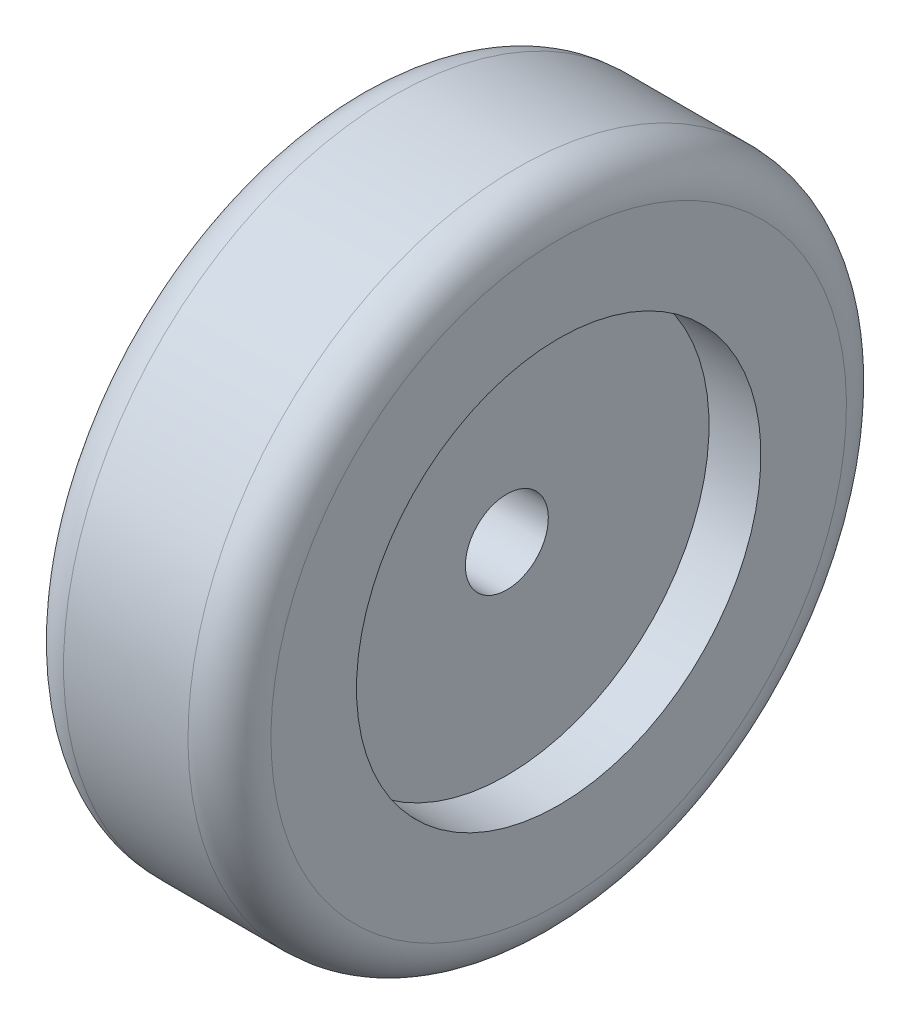
ISO-10303-21;
HEADER;
FILE_DESCRIPTION(('STEP AP214'),'2;1');
FILE_NAME('part.step','',(''),(''),'','','');
FILE_SCHEMA(('AUTOMOTIVE_DESIGN { 1 0 10303 214 1 1 1 1 }'));
ENDSEC;
DATA;
#1=APPLICATION_CONTEXT('core data for automotive mechanical design processes');
#2=APPLICATION_PROTOCOL_DEFINITION('international standard','automotive_design',2000,#1);
#3=PRODUCT_CONTEXT('',#1,'mechanical');
#4=PRODUCT('Part','Part','',(#3));
#5=PRODUCT_RELATED_PRODUCT_CATEGORY('part','',(#4));
#6=PRODUCT_DEFINITION_FORMATION('','',#4);
#7=PRODUCT_DEFINITION_CONTEXT('part definition',#1,'design');
#8=PRODUCT_DEFINITION('design','',#6,#7);
#9=PRODUCT_DEFINITION_SHAPE('','',#8);
#10=(LENGTH_UNIT() NAMED_UNIT(*) SI_UNIT(.MILLI.,.METRE.));
#11=(NAMED_UNIT(*) PLANE_ANGLE_UNIT() SI_UNIT($,.RADIAN.));
#12=(NAMED_UNIT(*) SI_UNIT($,.STERADIAN.) SOLID_ANGLE_UNIT());
#13=UNCERTAINTY_MEASURE_WITH_UNIT(LENGTH_MEASURE(1.E-05),#10,'distance_accuracy_value','');
#14=(GEOMETRIC_REPRESENTATION_CONTEXT(3) GLOBAL_UNCERTAINTY_ASSIGNED_CONTEXT((#13)) GLOBAL_UNIT_ASSIGNED_CONTEXT((#10,
#11,#12)) REPRESENTATION_CONTEXT('',''));
#15=CARTESIAN_POINT('',(0.,0.,0.));
#16=DIRECTION('',(0.,0.,1.));
#17=DIRECTION('',(1.,0.,0.));
#18=AXIS2_PLACEMENT_3D('',#15,#16,#17);
#19=CARTESIAN_POINT('',(0.,0.,0.));
#20=DIRECTION('',(-1.,0.,0.));
#21=DIRECTION('',(0.,-1.,0.));
#22=AXIS2_PLACEMENT_3D('',#19,#20,#21);
#23=PLANE('',#22);
#24=CARTESIAN_POINT('',(0.,0.,0.));
#25=DIRECTION('',(-1.,0.,0.));
#26=DIRECTION('',(0.,-1.,0.));
#27=AXIS2_PLACEMENT_3D('',#24,#25,#26);
#28=CIRCLE('',#27,4.);
#29=CARTESIAN_POINT('',(0.,-4.,0.));
#30=VERTEX_POINT('',#29);
#31=EDGE_CURVE('E68',#30,#30,#28,.T.);
#32=ORIENTED_EDGE('',*,*,#31,.T.);
#33=EDGE_LOOP('',(#32));
#34=FACE_BOUND('',#33,.T.);
#35=CARTESIAN_POINT('',(0.,0.,0.));
#36=DIRECTION('',(-1.,0.,0.));
#37=DIRECTION('',(0.,-1.,0.));
#38=AXIS2_PLACEMENT_3D('',#35,#36,#37);
#39=CIRCLE('',#38,19.5);
#40=CARTESIAN_POINT('',(0.,-19.5,0.));
#41=VERTEX_POINT('',#40);
#42=EDGE_CURVE('E56',#41,#41,#39,.T.);
#43=ORIENTED_EDGE('',*,*,#42,.F.);
#44=EDGE_LOOP('',(#43));
#45=FACE_BOUND('',#44,.T.);
#46=ADVANCED_FACE('F36',(#34,#45),#23,.F.);
#47=CARTESIAN_POINT('',(-18.,0.,0.));
#48=DIRECTION('',(-1.,0.,0.));
#49=DIRECTION('',(0.,-1.,0.));
#50=AXIS2_PLACEMENT_3D('',#47,#48,#49);
#51=CYLINDRICAL_SURFACE('',#50,19.5);
#52=CARTESIAN_POINT('',(5.,0.,0.));
#53=DIRECTION('',(-1.,0.,0.));
#54=DIRECTION('',(0.,-1.,0.));
#55=AXIS2_PLACEMENT_3D('',#52,#53,#54);
#56=CIRCLE('',#55,19.5);
#57=CARTESIAN_POINT('',(5.,-19.5,0.));
#58=VERTEX_POINT('',#57);
#59=EDGE_CURVE('E59',#58,#58,#56,.T.);
#60=ORIENTED_EDGE('',*,*,#59,.F.);
#61=EDGE_LOOP('',(#60));
#62=FACE_BOUND('',#61,.T.);
#63=ORIENTED_EDGE('',*,*,#42,.T.);
#64=EDGE_LOOP('',(#63));
#65=FACE_BOUND('',#64,.T.);
#66=ADVANCED_FACE('F102',(#62,#65),#51,.F.);
#67=CARTESIAN_POINT('',(5.,19.5,0.));
#68=DIRECTION('',(-1.,0.,0.));
#69=DIRECTION('',(0.,-1.,0.));
#70=AXIS2_PLACEMENT_3D('',#67,#68,#69);
#71=PLANE('',#70);
#72=CARTESIAN_POINT('',(5.,0.,0.));
#73=DIRECTION('',(-1.,0.,0.));
#74=DIRECTION('',(0.,-1.,0.));
#75=AXIS2_PLACEMENT_3D('',#72,#73,#74);
#76=CIRCLE('',#75,27.75);
#77=CARTESIAN_POINT('',(5.,-27.75,0.));
#78=VERTEX_POINT('',#77);
#79=EDGE_CURVE('E43',#78,#78,#76,.F.);
#80=ORIENTED_EDGE('',*,*,#79,.T.);
#81=EDGE_LOOP('',(#80));
#82=FACE_BOUND('',#81,.T.);
#83=ORIENTED_EDGE('',*,*,#59,.T.);
#84=EDGE_LOOP('',(#83));
#85=FACE_BOUND('',#84,.T.);
#86=ADVANCED_FACE('F98',(#82,#85),#71,.F.);
#87=CARTESIAN_POINT('',(-18.,0.,0.));
#88=DIRECTION('',(-1.,0.,0.));
#89=DIRECTION('',(0.,-1.,0.));
#90=AXIS2_PLACEMENT_3D('',#87,#88,#89);
#91=CYLINDRICAL_SURFACE('',#90,31.75);
#92=CARTESIAN_POINT('',(1.,0.,0.));
#93=DIRECTION('',(-1.,0.,0.));
#94=DIRECTION('',(0.,-1.,0.));
#95=AXIS2_PLACEMENT_3D('',#92,#93,#94);
#96=CIRCLE('',#95,31.75);
#97=CARTESIAN_POINT('',(1.,-31.75,0.));
#98=VERTEX_POINT('',#97);
#99=EDGE_CURVE('E47',#98,#98,#96,.T.);
#100=ORIENTED_EDGE('',*,*,#99,.T.);
#101=EDGE_LOOP('',(#100));
#102=FACE_BOUND('',#101,.T.);
#103=CARTESIAN_POINT('',(-11.,0.,0.));
#104=DIRECTION('',(1.,0.,0.));
#105=DIRECTION('',(0.,1.,0.));
#106=AXIS2_PLACEMENT_3D('',#103,#104,#105);
#107=CIRCLE('',#106,31.75);
#108=CARTESIAN_POINT('',(-11.,31.75,0.));
#109=VERTEX_POINT('',#108);
#110=EDGE_CURVE('E51',#109,#109,#107,.T.);
#111=ORIENTED_EDGE('',*,*,#110,.T.);
#112=EDGE_LOOP('',(#111));
#113=FACE_BOUND('',#112,.T.);
#114=ADVANCED_FACE('F92',(#102,#113),#91,.T.);
#115=CARTESIAN_POINT('',(-15.,31.75,0.));
#116=DIRECTION('',(1.,0.,0.));
#117=DIRECTION('',(0.,1.,0.));
#118=AXIS2_PLACEMENT_3D('',#115,#116,#117);
#119=PLANE('',#118);
#120=CARTESIAN_POINT('',(-15.,0.,0.));
#121=DIRECTION('',(1.,0.,0.));
#122=DIRECTION('',(0.,1.,0.));
#123=AXIS2_PLACEMENT_3D('',#120,#121,#122);
#124=CIRCLE('',#123,27.75);
#125=CARTESIAN_POINT('',(-15.,27.75,0.));
#126=VERTEX_POINT('',#125);
#127=EDGE_CURVE('E10',#126,#126,#124,.F.);
#128=ORIENTED_EDGE('',*,*,#127,.T.);
#129=EDGE_LOOP('',(#128));
#130=FACE_BOUND('',#129,.T.);
#131=CARTESIAN_POINT('',(-15.,0.,0.));
#132=DIRECTION('',(-1.,0.,0.));
#133=DIRECTION('',(0.,-1.,0.));
#134=AXIS2_PLACEMENT_3D('',#131,#132,#133);
#135=CIRCLE('',#134,19.5);
#136=CARTESIAN_POINT('',(-15.,-19.5,0.));
#137=VERTEX_POINT('',#136);
#138=EDGE_CURVE('E62',#137,#137,#135,.T.);
#139=ORIENTED_EDGE('',*,*,#138,.F.);
#140=EDGE_LOOP('',(#139));
#141=FACE_BOUND('',#140,.T.);
#142=ADVANCED_FACE('F87',(#130,#141),#119,.F.);
#143=CARTESIAN_POINT('',(-15.,0.,0.));
#144=DIRECTION('',(1.,0.,0.));
#145=DIRECTION('',(0.,1.,0.));
#146=AXIS2_PLACEMENT_3D('',#143,#144,#145);
#147=CONICAL_SURFACE('',#146,19.5,1.26491745539004);
#148=CARTESIAN_POINT('',(-18.,0.,0.));
#149=DIRECTION('',(-1.,0.,0.));
#150=DIRECTION('',(0.,-1.,0.));
#151=AXIS2_PLACEMENT_3D('',#148,#149,#150);
#152=CIRCLE('',#151,10.);
#153=CARTESIAN_POINT('',(-18.,-10.,0.));
#154=VERTEX_POINT('',#153);
#155=EDGE_CURVE('E65',#154,#154,#152,.T.);
#156=ORIENTED_EDGE('',*,*,#155,.F.);
#157=EDGE_LOOP('',(#156));
#158=FACE_BOUND('',#157,.T.);
#159=ORIENTED_EDGE('',*,*,#138,.T.);
#160=EDGE_LOOP('',(#159));
#161=FACE_BOUND('',#160,.T.);
#162=ADVANCED_FACE('F81',(#158,#161),#147,.T.);
#163=CARTESIAN_POINT('',(-18.,10.,0.));
#164=DIRECTION('',(1.,0.,0.));
#165=DIRECTION('',(0.,1.,0.));
#166=AXIS2_PLACEMENT_3D('',#163,#164,#165);
#167=PLANE('',#166);
#168=CARTESIAN_POINT('',(-18.,0.,0.));
#169=DIRECTION('',(-1.,0.,0.));
#170=DIRECTION('',(0.,-1.,0.));
#171=AXIS2_PLACEMENT_3D('',#168,#169,#170);
#172=CIRCLE('',#171,4.);
#173=CARTESIAN_POINT('',(-18.,-4.,0.));
#174=VERTEX_POINT('',#173);
#175=EDGE_CURVE('E71',#174,#174,#172,.T.);
#176=ORIENTED_EDGE('',*,*,#175,.F.);
#177=EDGE_LOOP('',(#176));
#178=FACE_BOUND('',#177,.T.);
#179=ORIENTED_EDGE('',*,*,#155,.T.);
#180=EDGE_LOOP('',(#179));
#181=FACE_BOUND('',#180,.T.);
#182=ADVANCED_FACE('F78',(#178,#181),#167,.F.);
#183=CARTESIAN_POINT('',(5.,0.,0.));
#184=DIRECTION('',(-1.,0.,0.));
#185=DIRECTION('',(0.,-1.,0.));
#186=AXIS2_PLACEMENT_3D('',#183,#184,#185);
#187=CYLINDRICAL_SURFACE('',#186,4.);
#188=ORIENTED_EDGE('',*,*,#175,.T.);
#189=EDGE_LOOP('',(#188));
#190=FACE_BOUND('',#189,.T.);
#191=ORIENTED_EDGE('',*,*,#31,.F.);
#192=EDGE_LOOP('',(#191));
#193=FACE_BOUND('',#192,.T.);
#194=ADVANCED_FACE('F75',(#190,#193),#187,.F.);
#195=CARTESIAN_POINT('',(1.,0.,0.));
#196=DIRECTION('',(-1.,0.,0.));
#197=DIRECTION('',(0.,-1.,0.));
#198=AXIS2_PLACEMENT_3D('',#195,#196,#197);
#199=TOROIDAL_SURFACE('',#198,27.75,4.);
#200=ORIENTED_EDGE('',*,*,#79,.F.);
#201=EDGE_LOOP('',(#200));
#202=FACE_BOUND('',#201,.T.);
#203=ORIENTED_EDGE('',*,*,#99,.F.);
#204=EDGE_LOOP('',(#203));
#205=FACE_BOUND('',#204,.T.);
#206=ADVANCED_FACE('F112',(#202,#205),#199,.T.);
#207=CARTESIAN_POINT('',(-11.,0.,0.));
#208=DIRECTION('',(1.,0.,0.));
#209=DIRECTION('',(0.,1.,0.));
#210=AXIS2_PLACEMENT_3D('',#207,#208,#209);
#211=TOROIDAL_SURFACE('',#210,27.75,4.);
#212=ORIENTED_EDGE('',*,*,#110,.F.);
#213=EDGE_LOOP('',(#212));
#214=FACE_BOUND('',#213,.T.);
#215=ORIENTED_EDGE('',*,*,#127,.F.);
#216=EDGE_LOOP('',(#215));
#217=FACE_BOUND('',#216,.T.);
#218=ADVANCED_FACE('F38',(#214,#217),#211,.T.);
#219=CLOSED_SHELL('',(#46,#66,#86,#114,#142,#162,#182,#194,#206,#218));
#220=MANIFOLD_SOLID_BREP('B2',#219);
#221=ADVANCED_BREP_SHAPE_REPRESENTATION('',(#18,#220),#14);
#222=SHAPE_DEFINITION_REPRESENTATION(#9,#221);
ENDSEC;
END-ISO-10303-21;
